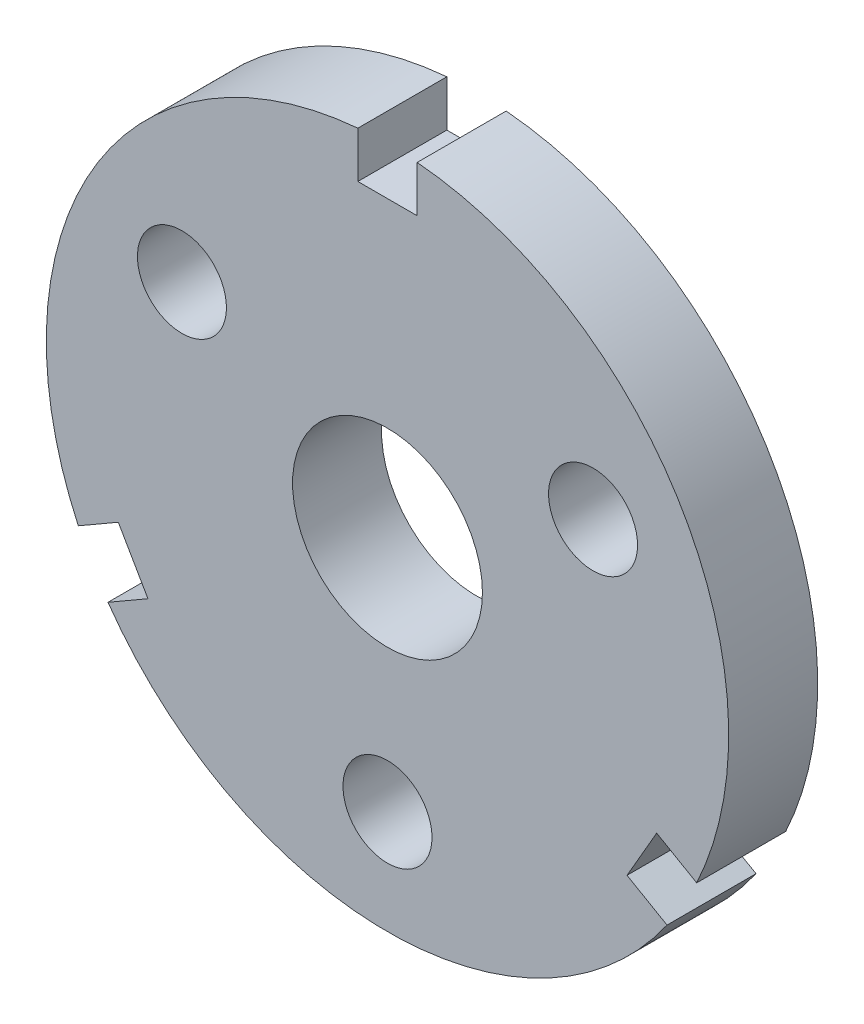
ISO-10303-21;
HEADER;
FILE_DESCRIPTION(('STEP AP214'),'2;1');
FILE_NAME('part.step','',(''),(''),'','','');
FILE_SCHEMA(('AUTOMOTIVE_DESIGN { 1 0 10303 214 1 1 1 1 }'));
ENDSEC;
DATA;
#1=APPLICATION_CONTEXT('core data for automotive mechanical design processes');
#2=APPLICATION_PROTOCOL_DEFINITION('international standard','automotive_design',2000,#1);
#3=PRODUCT_CONTEXT('',#1,'mechanical');
#4=PRODUCT('Part','Part','',(#3));
#5=PRODUCT_RELATED_PRODUCT_CATEGORY('part','',(#4));
#6=PRODUCT_DEFINITION_FORMATION('','',#4);
#7=PRODUCT_DEFINITION_CONTEXT('part definition',#1,'design');
#8=PRODUCT_DEFINITION('design','',#6,#7);
#9=PRODUCT_DEFINITION_SHAPE('','',#8);
#10=(LENGTH_UNIT() NAMED_UNIT(*) SI_UNIT(.MILLI.,.METRE.));
#11=(NAMED_UNIT(*) PLANE_ANGLE_UNIT() SI_UNIT($,.RADIAN.));
#12=(NAMED_UNIT(*) SI_UNIT($,.STERADIAN.) SOLID_ANGLE_UNIT());
#13=UNCERTAINTY_MEASURE_WITH_UNIT(LENGTH_MEASURE(1.E-05),#10,'distance_accuracy_value','');
#14=(GEOMETRIC_REPRESENTATION_CONTEXT(3) GLOBAL_UNCERTAINTY_ASSIGNED_CONTEXT((#13)) GLOBAL_UNIT_ASSIGNED_CONTEXT((#10,
#11,#12)) REPRESENTATION_CONTEXT('',''));
#15=CARTESIAN_POINT('',(0.,0.,0.));
#16=DIRECTION('',(0.,0.,1.));
#17=DIRECTION('',(1.,0.,0.));
#18=AXIS2_PLACEMENT_3D('',#15,#16,#17);
#19=CARTESIAN_POINT('',(-5.,0.,15.));
#20=DIRECTION('',(1.,0.,0.));
#21=DIRECTION('',(0.,0.,-1.));
#22=AXIS2_PLACEMENT_3D('',#19,#20,#21);
#23=PLANE('',#22);
#24=DIRECTION('',(0.,-1.,0.));
#25=VECTOR('',#24,1.);
#26=CARTESIAN_POINT('',(-5.,0.,0.));
#27=LINE('',#26,#25);
#28=CARTESIAN_POINT('',(-5.,57.282196186948,0.));
#29=VERTEX_POINT('',#28);
#30=CARTESIAN_POINT('',(-5.,49.5,0.));
#31=VERTEX_POINT('',#30);
#32=EDGE_CURVE('E189',#29,#31,#27,.T.);
#33=ORIENTED_EDGE('',*,*,#32,.F.);
#34=DIRECTION('',(0.,0.,-1.));
#35=VECTOR('',#34,1.);
#36=CARTESIAN_POINT('',(-5.,57.282196186948,15.));
#37=LINE('',#36,#35);
#38=CARTESIAN_POINT('',(-5.,57.282196186948,15.));
#39=VERTEX_POINT('',#38);
#40=EDGE_CURVE('E11',#39,#29,#37,.T.);
#41=ORIENTED_EDGE('',*,*,#40,.F.);
#42=DIRECTION('',(0.,-1.,0.));
#43=VECTOR('',#42,1.);
#44=CARTESIAN_POINT('',(-5.,0.,15.));
#45=LINE('',#44,#43);
#46=CARTESIAN_POINT('',(-5.,49.5,15.));
#47=VERTEX_POINT('',#46);
#48=EDGE_CURVE('E286',#39,#47,#45,.T.);
#49=ORIENTED_EDGE('',*,*,#48,.T.);
#50=DIRECTION('',(0.,0.,-1.));
#51=VECTOR('',#50,1.);
#52=CARTESIAN_POINT('',(-5.,49.5,15.));
#53=LINE('',#52,#51);
#54=EDGE_CURVE('E63',#47,#31,#53,.T.);
#55=ORIENTED_EDGE('',*,*,#54,.T.);
#56=EDGE_LOOP('',(#33,#41,#49,#55));
#57=FACE_BOUND('',#56,.T.);
#58=ADVANCED_FACE('F45',(#57),#23,.T.);
#59=CARTESIAN_POINT('',(0.,0.,15.));
#60=DIRECTION('',(0.,0.,-1.));
#61=DIRECTION('',(-1.,0.,0.));
#62=AXIS2_PLACEMENT_3D('',#59,#60,#61);
#63=CYLINDRICAL_SURFACE('',#62,57.5);
#64=CARTESIAN_POINT('',(0.,0.,0.));
#65=DIRECTION('',(0.,0.,1.));
#66=DIRECTION('',(1.,0.,0.));
#67=AXIS2_PLACEMENT_3D('',#64,#65,#66);
#68=CIRCLE('',#67,57.5);
#69=CARTESIAN_POINT('',(-52.1078370824611,-24.3109710745518,0.));
#70=VERTEX_POINT('',#69);
#71=EDGE_CURVE('E192',#29,#70,#68,.T.);
#72=ORIENTED_EDGE('',*,*,#71,.T.);
#73=DIRECTION('',(0.,0.,-1.));
#74=VECTOR('',#73,1.);
#75=CARTESIAN_POINT('',(-52.1078370824611,-24.3109710745518,15.));
#76=LINE('',#75,#74);
#77=CARTESIAN_POINT('',(-52.1078370824611,-24.3109710745518,15.));
#78=VERTEX_POINT('',#77);
#79=EDGE_CURVE('E55',#78,#70,#76,.T.);
#80=ORIENTED_EDGE('',*,*,#79,.F.);
#81=CARTESIAN_POINT('',(0.,0.,15.));
#82=DIRECTION('',(0.,0.,1.));
#83=DIRECTION('',(1.,0.,0.));
#84=AXIS2_PLACEMENT_3D('',#81,#82,#83);
#85=CIRCLE('',#84,57.5);
#86=EDGE_CURVE('E153',#39,#78,#85,.T.);
#87=ORIENTED_EDGE('',*,*,#86,.F.);
#88=ORIENTED_EDGE('',*,*,#40,.T.);
#89=EDGE_LOOP('',(#72,#80,#87,#88));
#90=FACE_BOUND('',#89,.T.);
#91=ADVANCED_FACE('F266',(#90),#63,.T.);
#92=CARTESIAN_POINT('',(-2.5,4.33012701892219,15.));
#93=DIRECTION('',(0.5,-0.866025403784438,0.));
#94=DIRECTION('',(0.866025403784438,0.5,0.));
#95=AXIS2_PLACEMENT_3D('',#92,#93,#94);
#96=PLANE('',#95);
#97=DIRECTION('',(-0.866025403784438,-0.5,0.));
#98=VECTOR('',#97,1.);
#99=CARTESIAN_POINT('',(-2.5,4.33012701892219,0.));
#100=LINE('',#99,#98);
#101=CARTESIAN_POINT('',(-45.3682574873297,-20.4198729810778,0.));
#102=VERTEX_POINT('',#101);
#103=EDGE_CURVE('E196',#102,#70,#100,.T.);
#104=ORIENTED_EDGE('',*,*,#103,.F.);
#105=DIRECTION('',(0.,0.,-1.));
#106=VECTOR('',#105,1.);
#107=CARTESIAN_POINT('',(-45.3682574873297,-20.4198729810778,15.));
#108=LINE('',#107,#106);
#109=CARTESIAN_POINT('',(-45.3682574873297,-20.4198729810778,15.));
#110=VERTEX_POINT('',#109);
#111=EDGE_CURVE('E254',#110,#102,#108,.T.);
#112=ORIENTED_EDGE('',*,*,#111,.F.);
#113=DIRECTION('',(-0.866025403784438,-0.5,0.));
#114=VECTOR('',#113,1.);
#115=CARTESIAN_POINT('',(-2.5,4.33012701892219,15.));
#116=LINE('',#115,#114);
#117=EDGE_CURVE('E263',#110,#78,#116,.T.);
#118=ORIENTED_EDGE('',*,*,#117,.T.);
#119=ORIENTED_EDGE('',*,*,#79,.T.);
#120=EDGE_LOOP('',(#104,#112,#118,#119));
#121=FACE_BOUND('',#120,.T.);
#122=ADVANCED_FACE('F261',(#121),#96,.T.);
#123=CARTESIAN_POINT('',(-42.8682574873297,-24.75,15.));
#124=DIRECTION('',(-0.866025403784438,-0.5,0.));
#125=DIRECTION('',(0.5,-0.866025403784438,0.));
#126=AXIS2_PLACEMENT_3D('',#123,#124,#125);
#127=PLANE('',#126);
#128=DIRECTION('',(-0.5,0.866025403784438,0.));
#129=VECTOR('',#128,1.);
#130=CARTESIAN_POINT('',(-42.8682574873297,-24.75,0.));
#131=LINE('',#130,#129);
#132=CARTESIAN_POINT('',(-40.3682574873297,-29.0801270189222,0.));
#133=VERTEX_POINT('',#132);
#134=EDGE_CURVE('E201',#133,#102,#131,.T.);
#135=ORIENTED_EDGE('',*,*,#134,.F.);
#136=DIRECTION('',(0.,0.,-1.));
#137=VECTOR('',#136,1.);
#138=CARTESIAN_POINT('',(-40.3682574873297,-29.0801270189222,15.));
#139=LINE('',#138,#137);
#140=CARTESIAN_POINT('',(-40.3682574873297,-29.0801270189222,15.));
#141=VERTEX_POINT('',#140);
#142=EDGE_CURVE('E251',#141,#133,#139,.T.);
#143=ORIENTED_EDGE('',*,*,#142,.F.);
#144=DIRECTION('',(-0.5,0.866025403784438,0.));
#145=VECTOR('',#144,1.);
#146=CARTESIAN_POINT('',(-42.8682574873297,-24.75,15.));
#147=LINE('',#146,#145);
#148=EDGE_CURVE('E277',#141,#110,#147,.T.);
#149=ORIENTED_EDGE('',*,*,#148,.T.);
#150=ORIENTED_EDGE('',*,*,#111,.T.);
#151=EDGE_LOOP('',(#135,#143,#149,#150));
#152=FACE_BOUND('',#151,.T.);
#153=ADVANCED_FACE('F274',(#152),#127,.T.);
#154=CARTESIAN_POINT('',(2.5,-4.33012701892219,15.));
#155=DIRECTION('',(-0.5,0.866025403784438,0.));
#156=DIRECTION('',(-0.866025403784438,-0.5,0.));
#157=AXIS2_PLACEMENT_3D('',#154,#155,#156);
#158=PLANE('',#157);
#159=DIRECTION('',(0.866025403784438,0.5,0.));
#160=VECTOR('',#159,1.);
#161=CARTESIAN_POINT('',(2.5,-4.33012701892219,0.));
#162=LINE('',#161,#160);
#163=CARTESIAN_POINT('',(-47.1078370824611,-32.9712251123962,0.));
#164=VERTEX_POINT('',#163);
#165=EDGE_CURVE('E205',#164,#133,#162,.T.);
#166=ORIENTED_EDGE('',*,*,#165,.F.);
#167=DIRECTION('',(0.,0.,-1.));
#168=VECTOR('',#167,1.);
#169=CARTESIAN_POINT('',(-47.1078370824611,-32.9712251123962,15.));
#170=LINE('',#169,#168);
#171=CARTESIAN_POINT('',(-47.1078370824611,-32.9712251123962,15.));
#172=VERTEX_POINT('',#171);
#173=EDGE_CURVE('E248',#172,#164,#170,.T.);
#174=ORIENTED_EDGE('',*,*,#173,.F.);
#175=DIRECTION('',(0.866025403784438,0.5,0.));
#176=VECTOR('',#175,1.);
#177=CARTESIAN_POINT('',(2.5,-4.33012701892219,15.));
#178=LINE('',#177,#176);
#179=EDGE_CURVE('E284',#172,#141,#178,.T.);
#180=ORIENTED_EDGE('',*,*,#179,.T.);
#181=ORIENTED_EDGE('',*,*,#142,.T.);
#182=EDGE_LOOP('',(#166,#174,#180,#181));
#183=FACE_BOUND('',#182,.T.);
#184=ADVANCED_FACE('F316',(#183),#158,.T.);
#185=CARTESIAN_POINT('',(47.1078370824611,-32.9712251123962,0.));
#186=VERTEX_POINT('',#185);
#187=EDGE_CURVE('E197',#164,#186,#68,.T.);
#188=ORIENTED_EDGE('',*,*,#187,.T.);
#189=DIRECTION('',(0.,0.,-1.));
#190=VECTOR('',#189,1.);
#191=CARTESIAN_POINT('',(47.1078370824611,-32.9712251123962,15.));
#192=LINE('',#191,#190);
#193=CARTESIAN_POINT('',(47.1078370824611,-32.9712251123962,15.));
#194=VERTEX_POINT('',#193);
#195=EDGE_CURVE('E245',#194,#186,#192,.T.);
#196=ORIENTED_EDGE('',*,*,#195,.F.);
#197=EDGE_CURVE('E152',#172,#194,#85,.T.);
#198=ORIENTED_EDGE('',*,*,#197,.F.);
#199=ORIENTED_EDGE('',*,*,#173,.T.);
#200=EDGE_LOOP('',(#188,#196,#198,#199));
#201=FACE_BOUND('',#200,.T.);
#202=ADVANCED_FACE('F308',(#201),#63,.T.);
#203=CARTESIAN_POINT('',(-2.5,-4.3301270189222,15.));
#204=DIRECTION('',(0.5,0.866025403784439,0.));
#205=DIRECTION('',(-0.866025403784439,0.5,0.));
#206=AXIS2_PLACEMENT_3D('',#203,#204,#205);
#207=PLANE('',#206);
#208=DIRECTION('',(0.866025403784439,-0.5,0.));
#209=VECTOR('',#208,1.);
#210=CARTESIAN_POINT('',(-2.5,-4.3301270189222,0.));
#211=LINE('',#210,#209);
#212=CARTESIAN_POINT('',(40.3682574873297,-29.0801270189222,0.));
#213=VERTEX_POINT('',#212);
#214=EDGE_CURVE('E209',#213,#186,#211,.T.);
#215=ORIENTED_EDGE('',*,*,#214,.F.);
#216=DIRECTION('',(0.,0.,-1.));
#217=VECTOR('',#216,1.);
#218=CARTESIAN_POINT('',(40.3682574873297,-29.0801270189222,15.));
#219=LINE('',#218,#217);
#220=CARTESIAN_POINT('',(40.3682574873297,-29.0801270189222,15.));
#221=VERTEX_POINT('',#220);
#222=EDGE_CURVE('E242',#221,#213,#219,.T.);
#223=ORIENTED_EDGE('',*,*,#222,.F.);
#224=DIRECTION('',(0.866025403784439,-0.5,0.));
#225=VECTOR('',#224,1.);
#226=CARTESIAN_POINT('',(-2.5,-4.3301270189222,15.));
#227=LINE('',#226,#225);
#228=EDGE_CURVE('E291',#221,#194,#227,.T.);
#229=ORIENTED_EDGE('',*,*,#228,.T.);
#230=ORIENTED_EDGE('',*,*,#195,.T.);
#231=EDGE_LOOP('',(#215,#223,#229,#230));
#232=FACE_BOUND('',#231,.T.);
#233=ADVANCED_FACE('F312',(#232),#207,.T.);
#234=CARTESIAN_POINT('',(42.8682574873297,-24.75,15.));
#235=DIRECTION('',(0.866025403784438,-0.5,0.));
#236=DIRECTION('',(0.5,0.866025403784438,0.));
#237=AXIS2_PLACEMENT_3D('',#234,#235,#236);
#238=PLANE('',#237);
#239=DIRECTION('',(-0.5,-0.866025403784438,0.));
#240=VECTOR('',#239,1.);
#241=CARTESIAN_POINT('',(42.8682574873297,-24.75,0.));
#242=LINE('',#241,#240);
#243=CARTESIAN_POINT('',(45.3682574873297,-20.4198729810778,0.));
#244=VERTEX_POINT('',#243);
#245=EDGE_CURVE('E213',#244,#213,#242,.T.);
#246=ORIENTED_EDGE('',*,*,#245,.F.);
#247=DIRECTION('',(0.,0.,-1.));
#248=VECTOR('',#247,1.);
#249=CARTESIAN_POINT('',(45.3682574873297,-20.4198729810778,15.));
#250=LINE('',#249,#248);
#251=CARTESIAN_POINT('',(45.3682574873297,-20.4198729810778,15.));
#252=VERTEX_POINT('',#251);
#253=EDGE_CURVE('E239',#252,#244,#250,.T.);
#254=ORIENTED_EDGE('',*,*,#253,.F.);
#255=DIRECTION('',(-0.5,-0.866025403784438,0.));
#256=VECTOR('',#255,1.);
#257=CARTESIAN_POINT('',(42.8682574873297,-24.75,15.));
#258=LINE('',#257,#256);
#259=EDGE_CURVE('E294',#252,#221,#258,.T.);
#260=ORIENTED_EDGE('',*,*,#259,.T.);
#261=ORIENTED_EDGE('',*,*,#222,.T.);
#262=EDGE_LOOP('',(#246,#254,#260,#261));
#263=FACE_BOUND('',#262,.T.);
#264=ADVANCED_FACE('F373',(#263),#238,.T.);
#265=CARTESIAN_POINT('',(2.5,4.3301270189222,15.));
#266=DIRECTION('',(-0.5,-0.866025403784439,0.));
#267=DIRECTION('',(0.866025403784439,-0.5,0.));
#268=AXIS2_PLACEMENT_3D('',#265,#266,#267);
#269=PLANE('',#268);
#270=DIRECTION('',(-0.866025403784439,0.5,0.));
#271=VECTOR('',#270,1.);
#272=CARTESIAN_POINT('',(2.5,4.3301270189222,0.));
#273=LINE('',#272,#271);
#274=CARTESIAN_POINT('',(52.1078370824611,-24.3109710745518,0.));
#275=VERTEX_POINT('',#274);
#276=EDGE_CURVE('E217',#275,#244,#273,.T.);
#277=ORIENTED_EDGE('',*,*,#276,.F.);
#278=DIRECTION('',(0.,0.,-1.));
#279=VECTOR('',#278,1.);
#280=CARTESIAN_POINT('',(52.1078370824611,-24.3109710745518,15.));
#281=LINE('',#280,#279);
#282=CARTESIAN_POINT('',(52.1078370824611,-24.3109710745518,15.));
#283=VERTEX_POINT('',#282);
#284=EDGE_CURVE('E162',#283,#275,#281,.T.);
#285=ORIENTED_EDGE('',*,*,#284,.F.);
#286=DIRECTION('',(-0.866025403784439,0.5,0.));
#287=VECTOR('',#286,1.);
#288=CARTESIAN_POINT('',(2.5,4.3301270189222,15.));
#289=LINE('',#288,#287);
#290=EDGE_CURVE('E148',#283,#252,#289,.T.);
#291=ORIENTED_EDGE('',*,*,#290,.T.);
#292=ORIENTED_EDGE('',*,*,#253,.T.);
#293=EDGE_LOOP('',(#277,#285,#291,#292));
#294=FACE_BOUND('',#293,.T.);
#295=ADVANCED_FACE('F301',(#294),#269,.T.);
#296=CARTESIAN_POINT('',(5.,57.282196186948,0.));
#297=VERTEX_POINT('',#296);
#298=EDGE_CURVE('E158',#275,#297,#68,.T.);
#299=ORIENTED_EDGE('',*,*,#298,.T.);
#300=DIRECTION('',(0.,0.,-1.));
#301=VECTOR('',#300,1.);
#302=CARTESIAN_POINT('',(5.,57.282196186948,15.));
#303=LINE('',#302,#301);
#304=CARTESIAN_POINT('',(5.,57.282196186948,15.));
#305=VERTEX_POINT('',#304);
#306=EDGE_CURVE('E155',#305,#297,#303,.T.);
#307=ORIENTED_EDGE('',*,*,#306,.F.);
#308=EDGE_CURVE('E138',#283,#305,#85,.T.);
#309=ORIENTED_EDGE('',*,*,#308,.F.);
#310=ORIENTED_EDGE('',*,*,#284,.T.);
#311=EDGE_LOOP('',(#299,#307,#309,#310));
#312=FACE_BOUND('',#311,.T.);
#313=ADVANCED_FACE('F156',(#312),#63,.T.);
#314=CARTESIAN_POINT('',(5.,0.,15.));
#315=DIRECTION('',(-1.,0.,0.));
#316=DIRECTION('',(0.,0.,1.));
#317=AXIS2_PLACEMENT_3D('',#314,#315,#316);
#318=PLANE('',#317);
#319=DIRECTION('',(0.,1.,0.));
#320=VECTOR('',#319,1.);
#321=CARTESIAN_POINT('',(5.,0.,0.));
#322=LINE('',#321,#320);
#323=CARTESIAN_POINT('',(5.,49.5,0.));
#324=VERTEX_POINT('',#323);
#325=EDGE_CURVE('E221',#324,#297,#322,.T.);
#326=ORIENTED_EDGE('',*,*,#325,.F.);
#327=DIRECTION('',(0.,0.,-1.));
#328=VECTOR('',#327,1.);
#329=CARTESIAN_POINT('',(5.,49.5,15.));
#330=LINE('',#329,#328);
#331=CARTESIAN_POINT('',(5.,49.5,15.));
#332=VERTEX_POINT('',#331);
#333=EDGE_CURVE('E100',#332,#324,#330,.T.);
#334=ORIENTED_EDGE('',*,*,#333,.F.);
#335=DIRECTION('',(0.,1.,0.));
#336=VECTOR('',#335,1.);
#337=CARTESIAN_POINT('',(5.,0.,15.));
#338=LINE('',#337,#336);
#339=EDGE_CURVE('E145',#332,#305,#338,.T.);
#340=ORIENTED_EDGE('',*,*,#339,.T.);
#341=ORIENTED_EDGE('',*,*,#306,.T.);
#342=EDGE_LOOP('',(#326,#334,#340,#341));
#343=FACE_BOUND('',#342,.T.);
#344=ADVANCED_FACE('F164',(#343),#318,.T.);
#345=CARTESIAN_POINT('',(0.,49.5,15.));
#346=DIRECTION('',(0.,1.,0.));
#347=DIRECTION('',(0.,0.,1.));
#348=AXIS2_PLACEMENT_3D('',#345,#346,#347);
#349=PLANE('',#348);
#350=DIRECTION('',(1.,0.,0.));
#351=VECTOR('',#350,1.);
#352=CARTESIAN_POINT('',(0.,49.5,0.));
#353=LINE('',#352,#351);
#354=EDGE_CURVE('E224',#31,#324,#353,.T.);
#355=ORIENTED_EDGE('',*,*,#354,.F.);
#356=ORIENTED_EDGE('',*,*,#54,.F.);
#357=DIRECTION('',(1.,0.,0.));
#358=VECTOR('',#357,1.);
#359=CARTESIAN_POINT('',(0.,49.5,15.));
#360=LINE('',#359,#358);
#361=EDGE_CURVE('E166',#47,#332,#360,.T.);
#362=ORIENTED_EDGE('',*,*,#361,.T.);
#363=ORIENTED_EDGE('',*,*,#333,.T.);
#364=EDGE_LOOP('',(#355,#356,#362,#363));
#365=FACE_BOUND('',#364,.T.);
#366=ADVANCED_FACE('F336',(#365),#349,.T.);
#367=CARTESIAN_POINT('',(0.,-40.,15.));
#368=DIRECTION('',(0.,0.,-1.));
#369=DIRECTION('',(-1.,0.,0.));
#370=AXIS2_PLACEMENT_3D('',#367,#368,#369);
#371=CYLINDRICAL_SURFACE('',#370,7.5);
#372=CARTESIAN_POINT('',(0.,-40.,15.));
#373=DIRECTION('',(0.,0.,1.));
#374=DIRECTION('',(1.,0.,0.));
#375=AXIS2_PLACEMENT_3D('',#372,#373,#374);
#376=CIRCLE('',#375,7.5);
#377=CARTESIAN_POINT('',(7.50000000000006,-40.,15.));
#378=VERTEX_POINT('',#377);
#379=EDGE_CURVE('E530',#378,#378,#376,.T.);
#380=ORIENTED_EDGE('',*,*,#379,.T.);
#381=EDGE_LOOP('',(#380));
#382=FACE_BOUND('',#381,.T.);
#383=CARTESIAN_POINT('',(0.,-40.,0.));
#384=DIRECTION('',(0.,0.,1.));
#385=DIRECTION('',(1.,0.,0.));
#386=AXIS2_PLACEMENT_3D('',#383,#384,#385);
#387=CIRCLE('',#386,7.5);
#388=CARTESIAN_POINT('',(7.50000000000006,-40.,0.));
#389=VERTEX_POINT('',#388);
#390=EDGE_CURVE('E185',#389,#389,#387,.T.);
#391=ORIENTED_EDGE('',*,*,#390,.F.);
#392=EDGE_LOOP('',(#391));
#393=FACE_BOUND('',#392,.T.);
#394=ADVANCED_FACE('F333',(#382,#393),#371,.F.);
#395=CARTESIAN_POINT('',(34.6410161513775,20.0000000000001,15.));
#396=DIRECTION('',(0.,0.,-1.));
#397=DIRECTION('',(-1.,0.,0.));
#398=AXIS2_PLACEMENT_3D('',#395,#396,#397);
#399=CYLINDRICAL_SURFACE('',#398,7.5);
#400=CARTESIAN_POINT('',(34.6410161513775,20.0000000000001,15.));
#401=DIRECTION('',(0.,0.,1.));
#402=DIRECTION('',(1.,0.,0.));
#403=AXIS2_PLACEMENT_3D('',#400,#401,#402);
#404=CIRCLE('',#403,7.5);
#405=CARTESIAN_POINT('',(42.1410161513775,20.0000000000001,15.));
#406=VERTEX_POINT('',#405);
#407=EDGE_CURVE('E348',#406,#406,#404,.T.);
#408=ORIENTED_EDGE('',*,*,#407,.T.);
#409=EDGE_LOOP('',(#408));
#410=FACE_BOUND('',#409,.T.);
#411=CARTESIAN_POINT('',(34.6410161513775,20.0000000000001,0.));
#412=DIRECTION('',(0.,0.,1.));
#413=DIRECTION('',(1.,0.,0.));
#414=AXIS2_PLACEMENT_3D('',#411,#412,#413);
#415=CIRCLE('',#414,7.5);
#416=CARTESIAN_POINT('',(42.1410161513775,20.0000000000001,0.));
#417=VERTEX_POINT('',#416);
#418=EDGE_CURVE('E181',#417,#417,#415,.T.);
#419=ORIENTED_EDGE('',*,*,#418,.F.);
#420=EDGE_LOOP('',(#419));
#421=FACE_BOUND('',#420,.T.);
#422=ADVANCED_FACE('F335',(#410,#421),#399,.F.);
#423=CARTESIAN_POINT('',(-34.6410161513776,19.9999999999999,15.));
#424=DIRECTION('',(0.,0.,-1.));
#425=DIRECTION('',(-1.,0.,0.));
#426=AXIS2_PLACEMENT_3D('',#423,#424,#425);
#427=CYLINDRICAL_SURFACE('',#426,7.5);
#428=CARTESIAN_POINT('',(-34.6410161513776,19.9999999999999,15.));
#429=DIRECTION('',(0.,0.,1.));
#430=DIRECTION('',(1.,0.,0.));
#431=AXIS2_PLACEMENT_3D('',#428,#429,#430);
#432=CIRCLE('',#431,7.5);
#433=CARTESIAN_POINT('',(-27.1410161513776,19.9999999999999,15.));
#434=VERTEX_POINT('',#433);
#435=EDGE_CURVE('E232',#434,#434,#432,.T.);
#436=ORIENTED_EDGE('',*,*,#435,.T.);
#437=EDGE_LOOP('',(#436));
#438=FACE_BOUND('',#437,.T.);
#439=CARTESIAN_POINT('',(-34.6410161513776,19.9999999999999,0.));
#440=DIRECTION('',(0.,0.,1.));
#441=DIRECTION('',(1.,0.,0.));
#442=AXIS2_PLACEMENT_3D('',#439,#440,#441);
#443=CIRCLE('',#442,7.5);
#444=CARTESIAN_POINT('',(-27.1410161513776,19.9999999999999,0.));
#445=VERTEX_POINT('',#444);
#446=EDGE_CURVE('E177',#445,#445,#443,.T.);
#447=ORIENTED_EDGE('',*,*,#446,.F.);
#448=EDGE_LOOP('',(#447));
#449=FACE_BOUND('',#448,.T.);
#450=ADVANCED_FACE('F47',(#438,#449),#427,.F.);
#451=CARTESIAN_POINT('',(0.,0.,15.));
#452=DIRECTION('',(0.,0.,-1.));
#453=DIRECTION('',(-1.,0.,0.));
#454=AXIS2_PLACEMENT_3D('',#451,#452,#453);
#455=CYLINDRICAL_SURFACE('',#454,16.);
#456=CARTESIAN_POINT('',(0.,0.,15.));
#457=DIRECTION('',(0.,0.,1.));
#458=DIRECTION('',(1.,0.,0.));
#459=AXIS2_PLACEMENT_3D('',#456,#457,#458);
#460=CIRCLE('',#459,16.);
#461=CARTESIAN_POINT('',(16.,0.,15.));
#462=VERTEX_POINT('',#461);
#463=EDGE_CURVE('E169',#462,#462,#460,.T.);
#464=ORIENTED_EDGE('',*,*,#463,.T.);
#465=EDGE_LOOP('',(#464));
#466=FACE_BOUND('',#465,.T.);
#467=CARTESIAN_POINT('',(0.,0.,0.));
#468=DIRECTION('',(0.,0.,1.));
#469=DIRECTION('',(1.,0.,0.));
#470=AXIS2_PLACEMENT_3D('',#467,#468,#469);
#471=CIRCLE('',#470,16.);
#472=CARTESIAN_POINT('',(16.,0.,0.));
#473=VERTEX_POINT('',#472);
#474=EDGE_CURVE('E228',#473,#473,#471,.T.);
#475=ORIENTED_EDGE('',*,*,#474,.F.);
#476=EDGE_LOOP('',(#475));
#477=FACE_BOUND('',#476,.T.);
#478=ADVANCED_FACE('F343',(#466,#477),#455,.F.);
#479=CARTESIAN_POINT('',(0.,0.,15.));
#480=DIRECTION('',(0.,0.,1.));
#481=DIRECTION('',(1.,0.,0.));
#482=AXIS2_PLACEMENT_3D('',#479,#480,#481);
#483=PLANE('',#482);
#484=ORIENTED_EDGE('',*,*,#435,.F.);
#485=EDGE_LOOP('',(#484));
#486=FACE_BOUND('',#485,.T.);
#487=ORIENTED_EDGE('',*,*,#407,.F.);
#488=EDGE_LOOP('',(#487));
#489=FACE_BOUND('',#488,.T.);
#490=ORIENTED_EDGE('',*,*,#379,.F.);
#491=EDGE_LOOP('',(#490));
#492=FACE_BOUND('',#491,.T.);
#493=ORIENTED_EDGE('',*,*,#48,.F.);
#494=ORIENTED_EDGE('',*,*,#86,.T.);
#495=ORIENTED_EDGE('',*,*,#117,.F.);
#496=ORIENTED_EDGE('',*,*,#148,.F.);
#497=ORIENTED_EDGE('',*,*,#179,.F.);
#498=ORIENTED_EDGE('',*,*,#197,.T.);
#499=ORIENTED_EDGE('',*,*,#228,.F.);
#500=ORIENTED_EDGE('',*,*,#259,.F.);
#501=ORIENTED_EDGE('',*,*,#290,.F.);
#502=ORIENTED_EDGE('',*,*,#308,.T.);
#503=ORIENTED_EDGE('',*,*,#339,.F.);
#504=ORIENTED_EDGE('',*,*,#361,.F.);
#505=EDGE_LOOP('',(#493,#494,#495,#496,#497,#498,#499,#500,#501,#502,#503,#504));
#506=FACE_BOUND('',#505,.T.);
#507=ORIENTED_EDGE('',*,*,#463,.F.);
#508=EDGE_LOOP('',(#507));
#509=FACE_BOUND('',#508,.T.);
#510=ADVANCED_FACE('F141',(#486,#489,#492,#506,#509),#483,.T.);
#511=CARTESIAN_POINT('',(0.,0.,0.));
#512=DIRECTION('',(0.,0.,1.));
#513=DIRECTION('',(1.,0.,0.));
#514=AXIS2_PLACEMENT_3D('',#511,#512,#513);
#515=PLANE('',#514);
#516=ORIENTED_EDGE('',*,*,#446,.T.);
#517=EDGE_LOOP('',(#516));
#518=FACE_BOUND('',#517,.T.);
#519=ORIENTED_EDGE('',*,*,#418,.T.);
#520=EDGE_LOOP('',(#519));
#521=FACE_BOUND('',#520,.T.);
#522=ORIENTED_EDGE('',*,*,#390,.T.);
#523=EDGE_LOOP('',(#522));
#524=FACE_BOUND('',#523,.T.);
#525=ORIENTED_EDGE('',*,*,#32,.T.);
#526=ORIENTED_EDGE('',*,*,#354,.T.);
#527=ORIENTED_EDGE('',*,*,#325,.T.);
#528=ORIENTED_EDGE('',*,*,#298,.F.);
#529=ORIENTED_EDGE('',*,*,#276,.T.);
#530=ORIENTED_EDGE('',*,*,#245,.T.);
#531=ORIENTED_EDGE('',*,*,#214,.T.);
#532=ORIENTED_EDGE('',*,*,#187,.F.);
#533=ORIENTED_EDGE('',*,*,#165,.T.);
#534=ORIENTED_EDGE('',*,*,#134,.T.);
#535=ORIENTED_EDGE('',*,*,#103,.T.);
#536=ORIENTED_EDGE('',*,*,#71,.F.);
#537=EDGE_LOOP('',(#525,#526,#527,#528,#529,#530,#531,#532,#533,#534,#535,#536));
#538=FACE_BOUND('',#537,.T.);
#539=ORIENTED_EDGE('',*,*,#474,.T.);
#540=EDGE_LOOP('',(#539));
#541=FACE_BOUND('',#540,.T.);
#542=ADVANCED_FACE('F268',(#518,#521,#524,#538,#541),#515,.F.);
#543=CLOSED_SHELL('',(#58,#91,#122,#153,#184,#202,#233,#264,#295,#313,#344,#366,#394,#422,#450,
#478,#510,#542));
#544=MANIFOLD_SOLID_BREP('B2',#543);
#545=ADVANCED_BREP_SHAPE_REPRESENTATION('',(#18,#544),#14);
#546=SHAPE_DEFINITION_REPRESENTATION(#9,#545);
ENDSEC;
END-ISO-10303-21;
